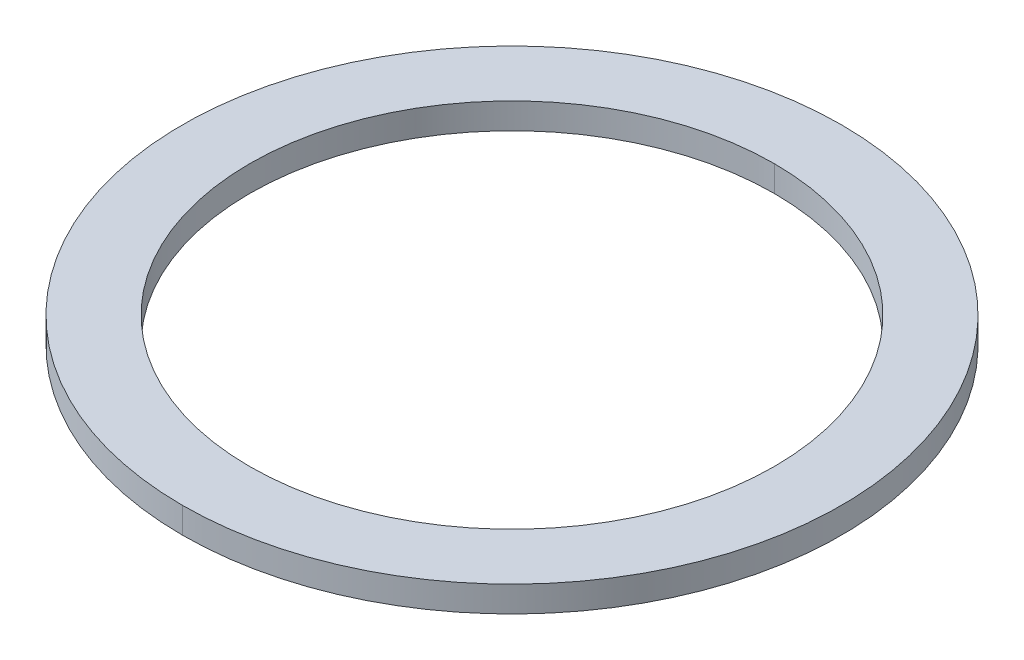
ISO-10303-21;
HEADER;
FILE_DESCRIPTION(('STEP AP214'),'2;1');
FILE_NAME('part.step','',(''),(''),'','','');
FILE_SCHEMA(('AUTOMOTIVE_DESIGN { 1 0 10303 214 1 1 1 1 }'));
ENDSEC;
DATA;
#1=APPLICATION_CONTEXT('core data for automotive mechanical design processes');
#2=APPLICATION_PROTOCOL_DEFINITION('international standard','automotive_design',2000,#1);
#3=PRODUCT_CONTEXT('',#1,'mechanical');
#4=PRODUCT('Part','Part','',(#3));
#5=PRODUCT_RELATED_PRODUCT_CATEGORY('part','',(#4));
#6=PRODUCT_DEFINITION_FORMATION('','',#4);
#7=PRODUCT_DEFINITION_CONTEXT('part definition',#1,'design');
#8=PRODUCT_DEFINITION('design','',#6,#7);
#9=PRODUCT_DEFINITION_SHAPE('','',#8);
#10=(LENGTH_UNIT() NAMED_UNIT(*) SI_UNIT(.MILLI.,.METRE.));
#11=(NAMED_UNIT(*) PLANE_ANGLE_UNIT() SI_UNIT($,.RADIAN.));
#12=(NAMED_UNIT(*) SI_UNIT($,.STERADIAN.) SOLID_ANGLE_UNIT());
#13=UNCERTAINTY_MEASURE_WITH_UNIT(LENGTH_MEASURE(1.E-05),#10,'distance_accuracy_value','');
#14=(GEOMETRIC_REPRESENTATION_CONTEXT(3) GLOBAL_UNCERTAINTY_ASSIGNED_CONTEXT((#13)) GLOBAL_UNIT_ASSIGNED_CONTEXT((#10,
#11,#12)) REPRESENTATION_CONTEXT('',''));
#15=CARTESIAN_POINT('',(0.,0.,0.));
#16=DIRECTION('',(0.,0.,1.));
#17=DIRECTION('',(1.,0.,0.));
#18=AXIS2_PLACEMENT_3D('',#15,#16,#17);
#19=CARTESIAN_POINT('',(0.,1.75,0.));
#20=DIRECTION('',(0.,-1.,0.));
#21=DIRECTION('',(0.,0.,-1.));
#22=AXIS2_PLACEMENT_3D('',#19,#20,#21);
#23=CYLINDRICAL_SURFACE('',#22,17.75);
#24=DIRECTION('',(0.,-1.,0.));
#25=VECTOR('',#24,1.);
#26=CARTESIAN_POINT('',(0.,1.75,17.75));
#27=LINE('',#26,#25);
#28=CARTESIAN_POINT('',(0.,1.75,17.75));
#29=VERTEX_POINT('',#28);
#30=CARTESIAN_POINT('',(0.,0.,17.75));
#31=VERTEX_POINT('',#30);
#32=EDGE_CURVE('E89',#29,#31,#27,.T.);
#33=ORIENTED_EDGE('',*,*,#32,.F.);
#34=CARTESIAN_POINT('',(0.,1.75,0.));
#35=DIRECTION('',(0.,1.,0.));
#36=DIRECTION('',(0.,0.,1.));
#37=AXIS2_PLACEMENT_3D('',#34,#35,#36);
#38=CIRCLE('',#37,17.75);
#39=CARTESIAN_POINT('',(0.,1.75,-17.75));
#40=VERTEX_POINT('',#39);
#41=EDGE_CURVE('E81',#29,#40,#38,.T.);
#42=ORIENTED_EDGE('',*,*,#41,.T.);
#43=DIRECTION('',(0.,-1.,0.));
#44=VECTOR('',#43,1.);
#45=CARTESIAN_POINT('',(0.,1.75,-17.75));
#46=LINE('',#45,#44);
#47=CARTESIAN_POINT('',(0.,0.,-17.75));
#48=VERTEX_POINT('',#47);
#49=EDGE_CURVE('E80',#40,#48,#46,.T.);
#50=ORIENTED_EDGE('',*,*,#49,.T.);
#51=CARTESIAN_POINT('',(0.,0.,0.));
#52=DIRECTION('',(0.,1.,0.));
#53=DIRECTION('',(0.,0.,1.));
#54=AXIS2_PLACEMENT_3D('',#51,#52,#53);
#55=CIRCLE('',#54,17.75);
#56=EDGE_CURVE('E11',#31,#48,#55,.T.);
#57=ORIENTED_EDGE('',*,*,#56,.F.);
#58=EDGE_LOOP('',(#33,#42,#50,#57));
#59=FACE_BOUND('',#58,.T.);
#60=ADVANCED_FACE('F17',(#59),#23,.F.);
#61=CARTESIAN_POINT('',(0.,1.75,0.));
#62=DIRECTION('',(0.,-1.,0.));
#63=DIRECTION('',(0.,0.,-1.));
#64=AXIS2_PLACEMENT_3D('',#61,#62,#63);
#65=CYLINDRICAL_SURFACE('',#64,22.3);
#66=DIRECTION('',(0.,-1.,0.));
#67=VECTOR('',#66,1.);
#68=CARTESIAN_POINT('',(0.,1.75,22.3));
#69=LINE('',#68,#67);
#70=CARTESIAN_POINT('',(0.,1.75,22.3));
#71=VERTEX_POINT('',#70);
#72=CARTESIAN_POINT('',(0.,0.,22.3));
#73=VERTEX_POINT('',#72);
#74=EDGE_CURVE('E101',#71,#73,#69,.T.);
#75=ORIENTED_EDGE('',*,*,#74,.F.);
#76=CARTESIAN_POINT('',(0.,1.75,0.));
#77=DIRECTION('',(0.,1.,0.));
#78=DIRECTION('',(0.,0.,1.));
#79=AXIS2_PLACEMENT_3D('',#76,#77,#78);
#80=CIRCLE('',#79,22.3);
#81=CARTESIAN_POINT('',(0.,1.75,-22.3));
#82=VERTEX_POINT('',#81);
#83=EDGE_CURVE('E65',#82,#71,#80,.T.);
#84=ORIENTED_EDGE('',*,*,#83,.F.);
#85=DIRECTION('',(0.,-1.,0.));
#86=VECTOR('',#85,1.);
#87=CARTESIAN_POINT('',(0.,1.75,-22.3));
#88=LINE('',#87,#86);
#89=CARTESIAN_POINT('',(0.,0.,-22.3));
#90=VERTEX_POINT('',#89);
#91=EDGE_CURVE('E108',#82,#90,#88,.T.);
#92=ORIENTED_EDGE('',*,*,#91,.T.);
#93=CARTESIAN_POINT('',(0.,0.,0.));
#94=DIRECTION('',(0.,1.,0.));
#95=DIRECTION('',(0.,0.,1.));
#96=AXIS2_PLACEMENT_3D('',#93,#94,#95);
#97=CIRCLE('',#96,22.3);
#98=EDGE_CURVE('E26',#90,#73,#97,.T.);
#99=ORIENTED_EDGE('',*,*,#98,.T.);
#100=EDGE_LOOP('',(#75,#84,#92,#99));
#101=FACE_BOUND('',#100,.T.);
#102=ADVANCED_FACE('F140',(#101),#65,.T.);
#103=CARTESIAN_POINT('',(0.,0.,0.));
#104=DIRECTION('',(0.,1.,0.));
#105=DIRECTION('',(1.,0.,0.));
#106=AXIS2_PLACEMENT_3D('',#103,#104,#105);
#107=PLANE('',#106);
#108=CARTESIAN_POINT('',(0.,0.,0.));
#109=DIRECTION('',(0.,1.,0.));
#110=DIRECTION('',(0.,0.,1.));
#111=AXIS2_PLACEMENT_3D('',#108,#109,#110);
#112=CIRCLE('',#111,17.75);
#113=EDGE_CURVE('E75',#48,#31,#112,.T.);
#114=ORIENTED_EDGE('',*,*,#113,.T.);
#115=ORIENTED_EDGE('',*,*,#56,.T.);
#116=EDGE_LOOP('',(#114,#115));
#117=FACE_BOUND('',#116,.T.);
#118=ORIENTED_EDGE('',*,*,#98,.F.);
#119=CARTESIAN_POINT('',(0.,0.,0.));
#120=DIRECTION('',(0.,1.,0.));
#121=DIRECTION('',(0.,0.,1.));
#122=AXIS2_PLACEMENT_3D('',#119,#120,#121);
#123=CIRCLE('',#122,22.3);
#124=EDGE_CURVE('E104',#73,#90,#123,.T.);
#125=ORIENTED_EDGE('',*,*,#124,.F.);
#126=EDGE_LOOP('',(#118,#125));
#127=FACE_BOUND('',#126,.T.);
#128=ADVANCED_FACE('F73',(#117,#127),#107,.F.);
#129=CARTESIAN_POINT('',(0.,1.75,0.));
#130=DIRECTION('',(0.,1.,0.));
#131=DIRECTION('',(1.,0.,0.));
#132=AXIS2_PLACEMENT_3D('',#129,#130,#131);
#133=PLANE('',#132);
#134=CARTESIAN_POINT('',(0.,1.75,0.));
#135=DIRECTION('',(0.,1.,0.));
#136=DIRECTION('',(0.,0.,1.));
#137=AXIS2_PLACEMENT_3D('',#134,#135,#136);
#138=CIRCLE('',#137,17.75);
#139=EDGE_CURVE('E95',#40,#29,#138,.T.);
#140=ORIENTED_EDGE('',*,*,#139,.F.);
#141=ORIENTED_EDGE('',*,*,#41,.F.);
#142=EDGE_LOOP('',(#140,#141));
#143=FACE_BOUND('',#142,.T.);
#144=ORIENTED_EDGE('',*,*,#83,.T.);
#145=CARTESIAN_POINT('',(0.,1.75,0.));
#146=DIRECTION('',(0.,1.,0.));
#147=DIRECTION('',(0.,0.,1.));
#148=AXIS2_PLACEMENT_3D('',#145,#146,#147);
#149=CIRCLE('',#148,22.3);
#150=EDGE_CURVE('E86',#71,#82,#149,.T.);
#151=ORIENTED_EDGE('',*,*,#150,.T.);
#152=EDGE_LOOP('',(#144,#151));
#153=FACE_BOUND('',#152,.T.);
#154=ADVANCED_FACE('F153',(#143,#153),#133,.T.);
#155=CARTESIAN_POINT('',(0.,1.75,0.));
#156=DIRECTION('',(0.,-1.,0.));
#157=DIRECTION('',(0.,0.,-1.));
#158=AXIS2_PLACEMENT_3D('',#155,#156,#157);
#159=CYLINDRICAL_SURFACE('',#158,22.3);
#160=ORIENTED_EDGE('',*,*,#150,.F.);
#161=ORIENTED_EDGE('',*,*,#74,.T.);
#162=ORIENTED_EDGE('',*,*,#124,.T.);
#163=ORIENTED_EDGE('',*,*,#91,.F.);
#164=EDGE_LOOP('',(#160,#161,#162,#163));
#165=FACE_BOUND('',#164,.T.);
#166=ADVANCED_FACE('F133',(#165),#159,.T.);
#167=CARTESIAN_POINT('',(0.,1.75,0.));
#168=DIRECTION('',(0.,-1.,0.));
#169=DIRECTION('',(0.,0.,-1.));
#170=AXIS2_PLACEMENT_3D('',#167,#168,#169);
#171=CYLINDRICAL_SURFACE('',#170,17.75);
#172=ORIENTED_EDGE('',*,*,#139,.T.);
#173=ORIENTED_EDGE('',*,*,#32,.T.);
#174=ORIENTED_EDGE('',*,*,#113,.F.);
#175=ORIENTED_EDGE('',*,*,#49,.F.);
#176=EDGE_LOOP('',(#172,#173,#174,#175));
#177=FACE_BOUND('',#176,.T.);
#178=ADVANCED_FACE('F88',(#177),#171,.F.);
#179=CLOSED_SHELL('',(#60,#102,#128,#154,#166,#178));
#180=MANIFOLD_SOLID_BREP('B1',#179);
#181=ADVANCED_BREP_SHAPE_REPRESENTATION('',(#18,#180),#14);
#182=SHAPE_DEFINITION_REPRESENTATION(#9,#181);
ENDSEC;
END-ISO-10303-21;
